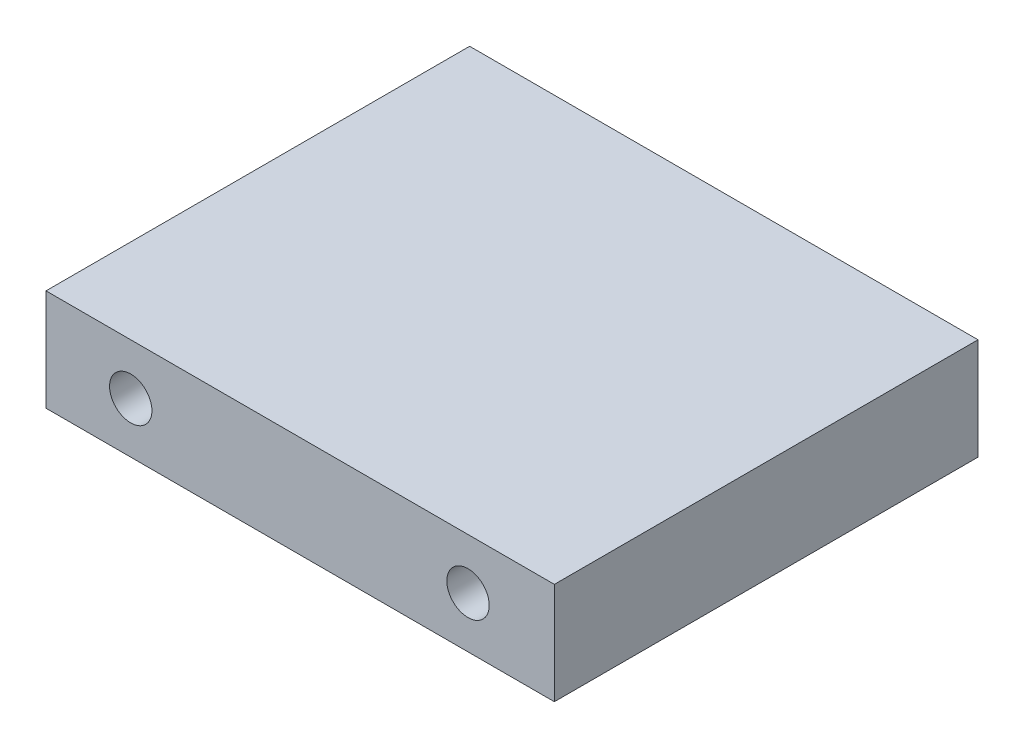
ISO-10303-21;
HEADER;
FILE_DESCRIPTION(('STEP AP214'),'2;1');
FILE_NAME('part.step','',(''),(''),'','','');
FILE_SCHEMA(('AUTOMOTIVE_DESIGN { 1 0 10303 214 1 1 1 1 }'));
ENDSEC;
DATA;
#1=APPLICATION_CONTEXT('core data for automotive mechanical design processes');
#2=APPLICATION_PROTOCOL_DEFINITION('international standard','automotive_design',2000,#1);
#3=PRODUCT_CONTEXT('',#1,'mechanical');
#4=PRODUCT('Part','Part','',(#3));
#5=PRODUCT_RELATED_PRODUCT_CATEGORY('part','',(#4));
#6=PRODUCT_DEFINITION_FORMATION('','',#4);
#7=PRODUCT_DEFINITION_CONTEXT('part definition',#1,'design');
#8=PRODUCT_DEFINITION('design','',#6,#7);
#9=PRODUCT_DEFINITION_SHAPE('','',#8);
#10=(LENGTH_UNIT() NAMED_UNIT(*) SI_UNIT(.MILLI.,.METRE.));
#11=(NAMED_UNIT(*) PLANE_ANGLE_UNIT() SI_UNIT($,.RADIAN.));
#12=(NAMED_UNIT(*) SI_UNIT($,.STERADIAN.) SOLID_ANGLE_UNIT());
#13=UNCERTAINTY_MEASURE_WITH_UNIT(LENGTH_MEASURE(1.E-05),#10,'distance_accuracy_value','');
#14=(GEOMETRIC_REPRESENTATION_CONTEXT(3) GLOBAL_UNCERTAINTY_ASSIGNED_CONTEXT((#13)) GLOBAL_UNIT_ASSIGNED_CONTEXT((#10,
#11,#12)) REPRESENTATION_CONTEXT('',''));
#15=CARTESIAN_POINT('',(0.,0.,0.));
#16=DIRECTION('',(0.,0.,1.));
#17=DIRECTION('',(1.,0.,0.));
#18=AXIS2_PLACEMENT_3D('',#15,#16,#17);
#19=CARTESIAN_POINT('',(15.,6.,12.5));
#20=DIRECTION('',(-1.,0.,0.));
#21=DIRECTION('',(0.,0.,1.));
#22=AXIS2_PLACEMENT_3D('',#19,#20,#21);
#23=PLANE('',#22);
#24=DIRECTION('',(0.,0.,-1.));
#25=VECTOR('',#24,1.);
#26=CARTESIAN_POINT('',(15.,0.,12.5));
#27=LINE('',#26,#25);
#28=CARTESIAN_POINT('',(15.,0.,12.5));
#29=VERTEX_POINT('',#28);
#30=CARTESIAN_POINT('',(15.,0.,-12.5));
#31=VERTEX_POINT('',#30);
#32=EDGE_CURVE('E125',#29,#31,#27,.T.);
#33=ORIENTED_EDGE('',*,*,#32,.T.);
#34=DIRECTION('',(0.,-1.,0.));
#35=VECTOR('',#34,1.);
#36=CARTESIAN_POINT('',(15.,6.,-12.5));
#37=LINE('',#36,#35);
#38=CARTESIAN_POINT('',(15.,6.,-12.5));
#39=VERTEX_POINT('',#38);
#40=EDGE_CURVE('E11',#39,#31,#37,.T.);
#41=ORIENTED_EDGE('',*,*,#40,.F.);
#42=DIRECTION('',(0.,0.,-1.));
#43=VECTOR('',#42,1.);
#44=CARTESIAN_POINT('',(15.,6.,12.5));
#45=LINE('',#44,#43);
#46=CARTESIAN_POINT('',(15.,6.,12.5));
#47=VERTEX_POINT('',#46);
#48=EDGE_CURVE('E126',#47,#39,#45,.T.);
#49=ORIENTED_EDGE('',*,*,#48,.F.);
#50=DIRECTION('',(0.,-1.,0.));
#51=VECTOR('',#50,1.);
#52=CARTESIAN_POINT('',(15.,6.,12.5));
#53=LINE('',#52,#51);
#54=EDGE_CURVE('E132',#47,#29,#53,.T.);
#55=ORIENTED_EDGE('',*,*,#54,.T.);
#56=EDGE_LOOP('',(#33,#41,#49,#55));
#57=FACE_BOUND('',#56,.T.);
#58=ADVANCED_FACE('F32',(#57),#23,.F.);
#59=CARTESIAN_POINT('',(-15.,6.,-12.5));
#60=DIRECTION('',(0.,0.,1.));
#61=DIRECTION('',(1.,0.,0.));
#62=AXIS2_PLACEMENT_3D('',#59,#60,#61);
#63=PLANE('',#62);
#64=CARTESIAN_POINT('',(7.50000000000001,3.,-12.5));
#65=DIRECTION('',(0.,0.,-1.));
#66=DIRECTION('',(-1.,0.,0.));
#67=AXIS2_PLACEMENT_3D('',#64,#65,#66);
#68=CIRCLE('',#67,1.24999999999999);
#69=CARTESIAN_POINT('',(6.25000000000002,3.,-12.5));
#70=VERTEX_POINT('',#69);
#71=EDGE_CURVE('E103',#70,#70,#68,.T.);
#72=ORIENTED_EDGE('',*,*,#71,.F.);
#73=EDGE_LOOP('',(#72));
#74=FACE_BOUND('',#73,.T.);
#75=CARTESIAN_POINT('',(-7.49999999999999,3.,-12.5));
#76=DIRECTION('',(0.,0.,-1.));
#77=DIRECTION('',(-1.,0.,0.));
#78=AXIS2_PLACEMENT_3D('',#75,#76,#77);
#79=CIRCLE('',#78,1.24999999999999);
#80=CARTESIAN_POINT('',(-8.74999999999998,3.,-12.5));
#81=VERTEX_POINT('',#80);
#82=EDGE_CURVE('E102',#81,#81,#79,.T.);
#83=ORIENTED_EDGE('',*,*,#82,.F.);
#84=EDGE_LOOP('',(#83));
#85=FACE_BOUND('',#84,.T.);
#86=DIRECTION('',(-1.,0.,0.));
#87=VECTOR('',#86,1.);
#88=CARTESIAN_POINT('',(-15.,0.,-12.5));
#89=LINE('',#88,#87);
#90=CARTESIAN_POINT('',(-15.,0.,-12.5));
#91=VERTEX_POINT('',#90);
#92=EDGE_CURVE('E135',#31,#91,#89,.T.);
#93=ORIENTED_EDGE('',*,*,#92,.T.);
#94=DIRECTION('',(0.,-1.,0.));
#95=VECTOR('',#94,1.);
#96=CARTESIAN_POINT('',(-15.,6.,-12.5));
#97=LINE('',#96,#95);
#98=CARTESIAN_POINT('',(-15.,6.,-12.5));
#99=VERTEX_POINT('',#98);
#100=EDGE_CURVE('E40',#99,#91,#97,.T.);
#101=ORIENTED_EDGE('',*,*,#100,.F.);
#102=DIRECTION('',(-1.,0.,0.));
#103=VECTOR('',#102,1.);
#104=CARTESIAN_POINT('',(-15.,6.,-12.5));
#105=LINE('',#104,#103);
#106=EDGE_CURVE('E79',#39,#99,#105,.T.);
#107=ORIENTED_EDGE('',*,*,#106,.F.);
#108=ORIENTED_EDGE('',*,*,#40,.T.);
#109=EDGE_LOOP('',(#93,#101,#107,#108));
#110=FACE_BOUND('',#109,.T.);
#111=ADVANCED_FACE('F159',(#74,#85,#110),#63,.F.);
#112=CARTESIAN_POINT('',(-15.,6.,12.5));
#113=DIRECTION('',(1.,0.,0.));
#114=DIRECTION('',(0.,0.,-1.));
#115=AXIS2_PLACEMENT_3D('',#112,#113,#114);
#116=PLANE('',#115);
#117=DIRECTION('',(0.,0.,1.));
#118=VECTOR('',#117,1.);
#119=CARTESIAN_POINT('',(-15.,0.,12.5));
#120=LINE('',#119,#118);
#121=CARTESIAN_POINT('',(-15.,0.,12.5));
#122=VERTEX_POINT('',#121);
#123=EDGE_CURVE('E66',#91,#122,#120,.T.);
#124=ORIENTED_EDGE('',*,*,#123,.T.);
#125=DIRECTION('',(0.,-1.,0.));
#126=VECTOR('',#125,1.);
#127=CARTESIAN_POINT('',(-15.,6.,12.5));
#128=LINE('',#127,#126);
#129=CARTESIAN_POINT('',(-15.,6.,12.5));
#130=VERTEX_POINT('',#129);
#131=EDGE_CURVE('E140',#130,#122,#128,.T.);
#132=ORIENTED_EDGE('',*,*,#131,.F.);
#133=DIRECTION('',(0.,0.,1.));
#134=VECTOR('',#133,1.);
#135=CARTESIAN_POINT('',(-15.,6.,12.5));
#136=LINE('',#135,#134);
#137=EDGE_CURVE('E129',#99,#130,#136,.T.);
#138=ORIENTED_EDGE('',*,*,#137,.F.);
#139=ORIENTED_EDGE('',*,*,#100,.T.);
#140=EDGE_LOOP('',(#124,#132,#138,#139));
#141=FACE_BOUND('',#140,.T.);
#142=ADVANCED_FACE('F142',(#141),#116,.F.);
#143=CARTESIAN_POINT('',(-15.,6.,12.5));
#144=DIRECTION('',(0.,0.,-1.));
#145=DIRECTION('',(-1.,0.,0.));
#146=AXIS2_PLACEMENT_3D('',#143,#144,#145);
#147=PLANE('',#146);
#148=CARTESIAN_POINT('',(-9.99999999999999,3.,12.5));
#149=DIRECTION('',(0.,0.,1.));
#150=DIRECTION('',(1.,0.,0.));
#151=AXIS2_PLACEMENT_3D('',#148,#149,#150);
#152=CIRCLE('',#151,1.25);
#153=CARTESIAN_POINT('',(-8.75,3.,12.5));
#154=VERTEX_POINT('',#153);
#155=EDGE_CURVE('E113',#154,#154,#152,.T.);
#156=ORIENTED_EDGE('',*,*,#155,.F.);
#157=EDGE_LOOP('',(#156));
#158=FACE_BOUND('',#157,.T.);
#159=CARTESIAN_POINT('',(9.9038926308026,3.00372850165331,12.5));
#160=DIRECTION('',(0.,0.,1.));
#161=DIRECTION('',(1.,0.,0.));
#162=AXIS2_PLACEMENT_3D('',#159,#160,#161);
#163=CIRCLE('',#162,1.25);
#164=CARTESIAN_POINT('',(11.1538926308026,3.00372850165331,12.5));
#165=VERTEX_POINT('',#164);
#166=EDGE_CURVE('E119',#165,#165,#163,.T.);
#167=ORIENTED_EDGE('',*,*,#166,.F.);
#168=EDGE_LOOP('',(#167));
#169=FACE_BOUND('',#168,.T.);
#170=DIRECTION('',(1.,0.,0.));
#171=VECTOR('',#170,1.);
#172=CARTESIAN_POINT('',(-15.,0.,12.5));
#173=LINE('',#172,#171);
#174=EDGE_CURVE('E72',#122,#29,#173,.T.);
#175=ORIENTED_EDGE('',*,*,#174,.T.);
#176=ORIENTED_EDGE('',*,*,#54,.F.);
#177=DIRECTION('',(1.,0.,0.));
#178=VECTOR('',#177,1.);
#179=CARTESIAN_POINT('',(-15.,6.,12.5));
#180=LINE('',#179,#178);
#181=EDGE_CURVE('E48',#130,#47,#180,.T.);
#182=ORIENTED_EDGE('',*,*,#181,.F.);
#183=ORIENTED_EDGE('',*,*,#131,.T.);
#184=EDGE_LOOP('',(#175,#176,#182,#183));
#185=FACE_BOUND('',#184,.T.);
#186=ADVANCED_FACE('F149',(#158,#169,#185),#147,.F.);
#187=CARTESIAN_POINT('',(15.,6.,-12.5));
#188=DIRECTION('',(0.,-1.,0.));
#189=DIRECTION('',(0.,0.,-1.));
#190=AXIS2_PLACEMENT_3D('',#187,#188,#189);
#191=PLANE('',#190);
#192=ORIENTED_EDGE('',*,*,#48,.T.);
#193=ORIENTED_EDGE('',*,*,#106,.T.);
#194=ORIENTED_EDGE('',*,*,#137,.T.);
#195=ORIENTED_EDGE('',*,*,#181,.T.);
#196=EDGE_LOOP('',(#192,#193,#194,#195));
#197=FACE_BOUND('',#196,.T.);
#198=ADVANCED_FACE('F151',(#197),#191,.F.);
#199=CARTESIAN_POINT('',(15.,0.,-12.5));
#200=DIRECTION('',(0.,-1.,0.));
#201=DIRECTION('',(0.,0.,-1.));
#202=AXIS2_PLACEMENT_3D('',#199,#200,#201);
#203=PLANE('',#202);
#204=ORIENTED_EDGE('',*,*,#32,.F.);
#205=ORIENTED_EDGE('',*,*,#174,.F.);
#206=ORIENTED_EDGE('',*,*,#123,.F.);
#207=ORIENTED_EDGE('',*,*,#92,.F.);
#208=EDGE_LOOP('',(#204,#205,#206,#207));
#209=FACE_BOUND('',#208,.T.);
#210=ADVANCED_FACE('F145',(#209),#203,.T.);
#211=CARTESIAN_POINT('',(9.9038926308026,3.00372850165331,2.5));
#212=DIRECTION('',(0.,0.,1.));
#213=DIRECTION('',(1.,0.,0.));
#214=AXIS2_PLACEMENT_3D('',#211,#212,#213);
#215=CONICAL_SURFACE('',#214,1.25,1.02974425867665);
#216=CARTESIAN_POINT('',(9.9038926308026,3.00372850165331,1.74892422621555));
#217=VERTEX_POINT('',#216);
#218=VERTEX_LOOP('',#217);
#219=FACE_BOUND('',#218,.T.);
#220=CARTESIAN_POINT('',(9.9038926308026,3.00372850165331,2.5));
#221=DIRECTION('',(0.,0.,1.));
#222=DIRECTION('',(1.,0.,0.));
#223=AXIS2_PLACEMENT_3D('',#220,#221,#222);
#224=CIRCLE('',#223,1.25);
#225=CARTESIAN_POINT('',(11.1538926308026,3.00372850165331,2.5));
#226=VERTEX_POINT('',#225);
#227=EDGE_CURVE('E122',#226,#226,#224,.T.);
#228=ORIENTED_EDGE('',*,*,#227,.T.);
#229=EDGE_LOOP('',(#228));
#230=FACE_BOUND('',#229,.T.);
#231=ADVANCED_FACE('F198',(#219,#230),#215,.F.);
#232=CARTESIAN_POINT('',(9.9038926308026,3.00372850165331,12.5));
#233=DIRECTION('',(0.,0.,1.));
#234=DIRECTION('',(1.,0.,0.));
#235=AXIS2_PLACEMENT_3D('',#232,#233,#234);
#236=CYLINDRICAL_SURFACE('',#235,1.25);
#237=ORIENTED_EDGE('',*,*,#227,.F.);
#238=EDGE_LOOP('',(#237));
#239=FACE_BOUND('',#238,.T.);
#240=ORIENTED_EDGE('',*,*,#166,.T.);
#241=EDGE_LOOP('',(#240));
#242=FACE_BOUND('',#241,.T.);
#243=ADVANCED_FACE('F194',(#239,#242),#236,.F.);
#244=CARTESIAN_POINT('',(-9.99999999999999,3.,2.5));
#245=DIRECTION('',(0.,0.,1.));
#246=DIRECTION('',(1.,0.,0.));
#247=AXIS2_PLACEMENT_3D('',#244,#245,#246);
#248=CONICAL_SURFACE('',#247,1.25,1.02974425867665);
#249=CARTESIAN_POINT('',(-10.,3.,1.74892422621555));
#250=VERTEX_POINT('',#249);
#251=VERTEX_LOOP('',#250);
#252=FACE_BOUND('',#251,.T.);
#253=CARTESIAN_POINT('',(-9.99999999999999,3.,2.5));
#254=DIRECTION('',(0.,0.,1.));
#255=DIRECTION('',(1.,0.,0.));
#256=AXIS2_PLACEMENT_3D('',#253,#254,#255);
#257=CIRCLE('',#256,1.25);
#258=CARTESIAN_POINT('',(-8.75,3.,2.5));
#259=VERTEX_POINT('',#258);
#260=EDGE_CURVE('E116',#259,#259,#257,.T.);
#261=ORIENTED_EDGE('',*,*,#260,.T.);
#262=EDGE_LOOP('',(#261));
#263=FACE_BOUND('',#262,.T.);
#264=ADVANCED_FACE('F190',(#252,#263),#248,.F.);
#265=CARTESIAN_POINT('',(-9.99999999999999,3.,12.5));
#266=DIRECTION('',(0.,0.,1.));
#267=DIRECTION('',(1.,0.,0.));
#268=AXIS2_PLACEMENT_3D('',#265,#266,#267);
#269=CYLINDRICAL_SURFACE('',#268,1.25);
#270=ORIENTED_EDGE('',*,*,#260,.F.);
#271=EDGE_LOOP('',(#270));
#272=FACE_BOUND('',#271,.T.);
#273=ORIENTED_EDGE('',*,*,#155,.T.);
#274=EDGE_LOOP('',(#273));
#275=FACE_BOUND('',#274,.T.);
#276=ADVANCED_FACE('F182',(#272,#275),#269,.F.);
#277=CARTESIAN_POINT('',(-7.49999999999999,3.,-1.50000000000001));
#278=DIRECTION('',(0.,0.,-1.));
#279=DIRECTION('',(-1.,0.,0.));
#280=AXIS2_PLACEMENT_3D('',#277,#278,#279);
#281=CONICAL_SURFACE('',#280,1.24999999999999,1.02974425867665);
#282=CARTESIAN_POINT('',(-7.5,3.,-0.748924226215551));
#283=VERTEX_POINT('',#282);
#284=VERTEX_LOOP('',#283);
#285=FACE_BOUND('',#284,.T.);
#286=CARTESIAN_POINT('',(-7.49999999999999,3.,-1.50000000000001));
#287=DIRECTION('',(0.,0.,-1.));
#288=DIRECTION('',(-1.,0.,0.));
#289=AXIS2_PLACEMENT_3D('',#286,#287,#288);
#290=CIRCLE('',#289,1.24999999999999);
#291=CARTESIAN_POINT('',(-8.74999999999998,3.,-1.50000000000001));
#292=VERTEX_POINT('',#291);
#293=EDGE_CURVE('E106',#292,#292,#290,.T.);
#294=ORIENTED_EDGE('',*,*,#293,.T.);
#295=EDGE_LOOP('',(#294));
#296=FACE_BOUND('',#295,.T.);
#297=ADVANCED_FACE('F176',(#285,#296),#281,.F.);
#298=CARTESIAN_POINT('',(-7.49999999999999,3.,-12.5));
#299=DIRECTION('',(0.,0.,-1.));
#300=DIRECTION('',(-1.,0.,0.));
#301=AXIS2_PLACEMENT_3D('',#298,#299,#300);
#302=CYLINDRICAL_SURFACE('',#301,1.24999999999999);
#303=ORIENTED_EDGE('',*,*,#293,.F.);
#304=EDGE_LOOP('',(#303));
#305=FACE_BOUND('',#304,.T.);
#306=ORIENTED_EDGE('',*,*,#82,.T.);
#307=EDGE_LOOP('',(#306));
#308=FACE_BOUND('',#307,.T.);
#309=ADVANCED_FACE('F96',(#305,#308),#302,.F.);
#310=CARTESIAN_POINT('',(7.50000000000001,3.,-1.50000000000001));
#311=DIRECTION('',(0.,0.,-1.));
#312=DIRECTION('',(-1.,0.,0.));
#313=AXIS2_PLACEMENT_3D('',#310,#311,#312);
#314=CONICAL_SURFACE('',#313,1.24999999999999,1.02974425867665);
#315=CARTESIAN_POINT('',(7.5,3.,-0.748924226215551));
#316=VERTEX_POINT('',#315);
#317=VERTEX_LOOP('',#316);
#318=FACE_BOUND('',#317,.T.);
#319=CARTESIAN_POINT('',(7.50000000000001,3.,-1.50000000000001));
#320=DIRECTION('',(0.,0.,-1.));
#321=DIRECTION('',(-1.,0.,0.));
#322=AXIS2_PLACEMENT_3D('',#319,#320,#321);
#323=CIRCLE('',#322,1.24999999999999);
#324=CARTESIAN_POINT('',(6.25000000000002,3.,-1.50000000000001));
#325=VERTEX_POINT('',#324);
#326=EDGE_CURVE('E100',#325,#325,#323,.T.);
#327=ORIENTED_EDGE('',*,*,#326,.T.);
#328=EDGE_LOOP('',(#327));
#329=FACE_BOUND('',#328,.T.);
#330=ADVANCED_FACE('F92',(#318,#329),#314,.F.);
#331=CARTESIAN_POINT('',(7.50000000000001,3.,-12.5));
#332=DIRECTION('',(0.,0.,-1.));
#333=DIRECTION('',(-1.,0.,0.));
#334=AXIS2_PLACEMENT_3D('',#331,#332,#333);
#335=CYLINDRICAL_SURFACE('',#334,1.24999999999999);
#336=ORIENTED_EDGE('',*,*,#326,.F.);
#337=EDGE_LOOP('',(#336));
#338=FACE_BOUND('',#337,.T.);
#339=ORIENTED_EDGE('',*,*,#71,.T.);
#340=EDGE_LOOP('',(#339));
#341=FACE_BOUND('',#340,.T.);
#342=ADVANCED_FACE('F95',(#338,#341),#335,.F.);
#343=CLOSED_SHELL('',(#58,#111,#142,#186,#198,#210,#231,#243,#264,#276,#297,#309,#330,#342));
#344=MANIFOLD_SOLID_BREP('B2',#343);
#345=ADVANCED_BREP_SHAPE_REPRESENTATION('',(#18,#344),#14);
#346=SHAPE_DEFINITION_REPRESENTATION(#9,#345);
ENDSEC;
END-ISO-10303-21;
